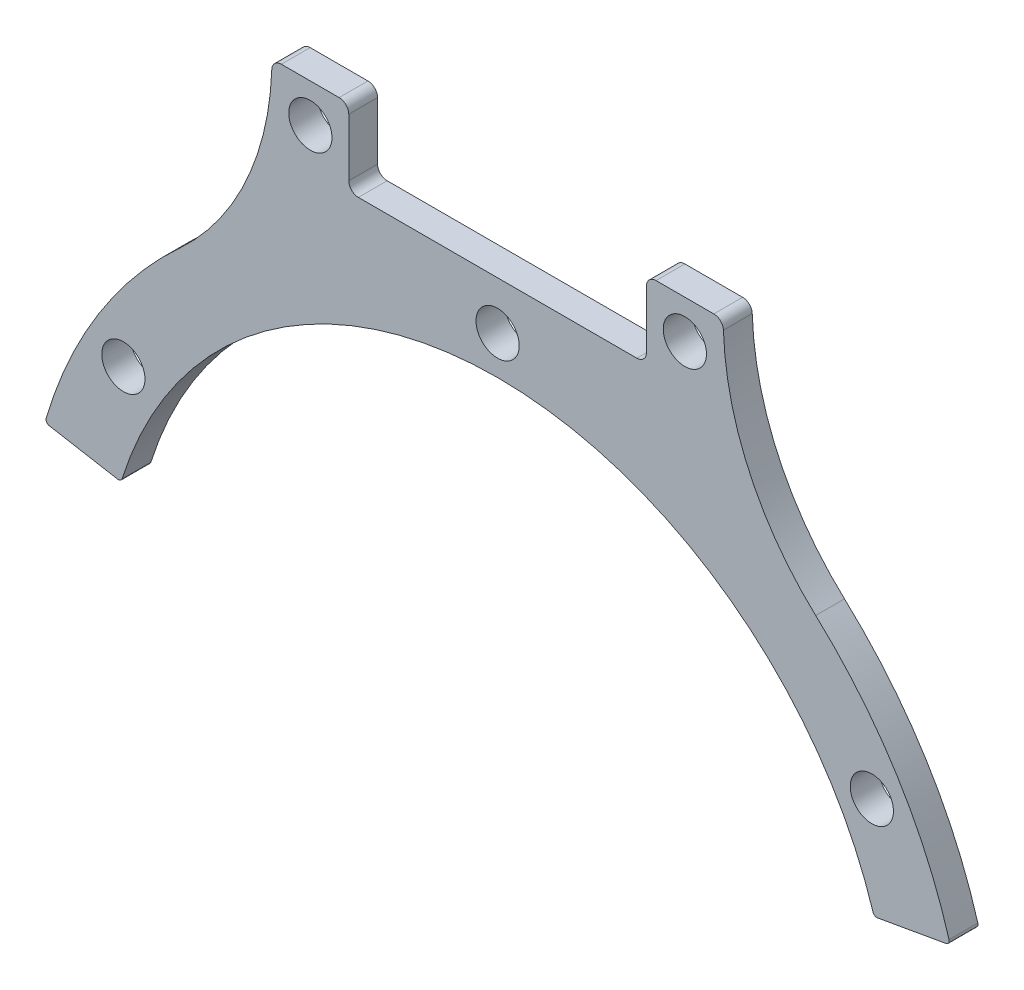
ISO-10303-21;
HEADER;
FILE_DESCRIPTION(('STEP AP214'),'2;1');
FILE_NAME('part.step','',(''),(''),'','','');
FILE_SCHEMA(('AUTOMOTIVE_DESIGN { 1 0 10303 214 1 1 1 1 }'));
ENDSEC;
DATA;
#1=APPLICATION_CONTEXT('core data for automotive mechanical design processes');
#2=APPLICATION_PROTOCOL_DEFINITION('international standard','automotive_design',2000,#1);
#3=PRODUCT_CONTEXT('',#1,'mechanical');
#4=PRODUCT('Part','Part','',(#3));
#5=PRODUCT_RELATED_PRODUCT_CATEGORY('part','',(#4));
#6=PRODUCT_DEFINITION_FORMATION('','',#4);
#7=PRODUCT_DEFINITION_CONTEXT('part definition',#1,'design');
#8=PRODUCT_DEFINITION('design','',#6,#7);
#9=PRODUCT_DEFINITION_SHAPE('','',#8);
#10=(LENGTH_UNIT() NAMED_UNIT(*) SI_UNIT(.MILLI.,.METRE.));
#11=(NAMED_UNIT(*) PLANE_ANGLE_UNIT() SI_UNIT($,.RADIAN.));
#12=(NAMED_UNIT(*) SI_UNIT($,.STERADIAN.) SOLID_ANGLE_UNIT());
#13=UNCERTAINTY_MEASURE_WITH_UNIT(LENGTH_MEASURE(1.E-05),#10,'distance_accuracy_value','');
#14=(GEOMETRIC_REPRESENTATION_CONTEXT(3) GLOBAL_UNCERTAINTY_ASSIGNED_CONTEXT((#13)) GLOBAL_UNIT_ASSIGNED_CONTEXT((#10,
#11,#12)) REPRESENTATION_CONTEXT('',''));
#15=CARTESIAN_POINT('',(0.,0.,0.));
#16=DIRECTION('',(0.,0.,1.));
#17=DIRECTION('',(1.,0.,0.));
#18=AXIS2_PLACEMENT_3D('',#15,#16,#17);
#19=CARTESIAN_POINT('',(53.2107843137256,-2.,3.));
#20=DIRECTION('',(0.,0.,-1.));
#21=DIRECTION('',(-1.,0.,0.));
#22=AXIS2_PLACEMENT_3D('',#19,#20,#21);
#23=CYLINDRICAL_SURFACE('',#22,29.7107843137256);
#24=CARTESIAN_POINT('',(53.2107843137256,-2.,0.));
#25=DIRECTION('',(0.,0.,1.));
#26=DIRECTION('',(1.,0.,0.));
#27=AXIS2_PLACEMENT_3D('',#24,#25,#26);
#28=CIRCLE('',#27,29.7107843137256);
#29=CARTESIAN_POINT('',(23.5157549659432,-2.96743814844374,0.));
#30=VERTEX_POINT('',#29);
#31=CARTESIAN_POINT('',(33.1254281621723,-23.8931307218037,0.));
#32=VERTEX_POINT('',#31);
#33=EDGE_CURVE('E233',#30,#32,#28,.T.);
#34=ORIENTED_EDGE('',*,*,#33,.F.);
#35=DIRECTION('',(0.,0.,-1.));
#36=VECTOR('',#35,1.);
#37=CARTESIAN_POINT('',(23.5157549659432,-2.96743814844374,3.));
#38=LINE('',#37,#36);
#39=CARTESIAN_POINT('',(23.5157549659432,-2.96743814844374,3.));
#40=VERTEX_POINT('',#39);
#41=EDGE_CURVE('E11',#40,#30,#38,.T.);
#42=ORIENTED_EDGE('',*,*,#41,.F.);
#43=CARTESIAN_POINT('',(53.2107843137256,-2.,3.));
#44=DIRECTION('',(0.,0.,1.));
#45=DIRECTION('',(1.,0.,0.));
#46=AXIS2_PLACEMENT_3D('',#43,#44,#45);
#47=CIRCLE('',#46,29.7107843137256);
#48=CARTESIAN_POINT('',(33.1254281621723,-23.8931307218037,3.));
#49=VERTEX_POINT('',#48);
#50=EDGE_CURVE('E318',#40,#49,#47,.T.);
#51=ORIENTED_EDGE('',*,*,#50,.T.);
#52=DIRECTION('',(0.,0.,-1.));
#53=VECTOR('',#52,1.);
#54=CARTESIAN_POINT('',(33.1254281621723,-23.8931307218037,3.));
#55=LINE('',#54,#53);
#56=EDGE_CURVE('E48',#49,#32,#55,.T.);
#57=ORIENTED_EDGE('',*,*,#56,.T.);
#58=EDGE_LOOP('',(#34,#42,#51,#57));
#59=FACE_BOUND('',#58,.T.);
#60=ADVANCED_FACE('F45',(#59),#23,.F.);
#61=CARTESIAN_POINT('',(22.5162852436288,-3.,3.));
#62=DIRECTION('',(0.,0.,-1.));
#63=DIRECTION('',(-1.,0.,0.));
#64=AXIS2_PLACEMENT_3D('',#61,#62,#63);
#65=CYLINDRICAL_SURFACE('',#64,1.);
#66=CARTESIAN_POINT('',(22.5162852436288,-3.,0.));
#67=DIRECTION('',(0.,0.,-1.));
#68=DIRECTION('',(-1.,0.,0.));
#69=AXIS2_PLACEMENT_3D('',#66,#67,#68);
#70=CIRCLE('',#69,1.);
#71=CARTESIAN_POINT('',(22.5162852436288,-2.,0.));
#72=VERTEX_POINT('',#71);
#73=EDGE_CURVE('E315',#72,#30,#70,.T.);
#74=ORIENTED_EDGE('',*,*,#73,.F.);
#75=DIRECTION('',(0.,0.,-1.));
#76=VECTOR('',#75,1.);
#77=CARTESIAN_POINT('',(22.5162852436288,-2.,3.));
#78=LINE('',#77,#76);
#79=CARTESIAN_POINT('',(22.5162852436288,-2.,3.));
#80=VERTEX_POINT('',#79);
#81=EDGE_CURVE('E55',#80,#72,#78,.T.);
#82=ORIENTED_EDGE('',*,*,#81,.F.);
#83=CARTESIAN_POINT('',(22.5162852436288,-3.,3.));
#84=DIRECTION('',(0.,0.,-1.));
#85=DIRECTION('',(-1.,0.,0.));
#86=AXIS2_PLACEMENT_3D('',#83,#84,#85);
#87=CIRCLE('',#86,1.);
#88=EDGE_CURVE('E218',#80,#40,#87,.T.);
#89=ORIENTED_EDGE('',*,*,#88,.T.);
#90=ORIENTED_EDGE('',*,*,#41,.T.);
#91=EDGE_LOOP('',(#74,#82,#89,#90));
#92=FACE_BOUND('',#91,.T.);
#93=ADVANCED_FACE('F379',(#92),#65,.T.);
#94=CARTESIAN_POINT('',(16.5,-2.,3.));
#95=DIRECTION('',(0.,1.,0.));
#96=DIRECTION('',(0.,0.,1.));
#97=AXIS2_PLACEMENT_3D('',#94,#95,#96);
#98=PLANE('',#97);
#99=DIRECTION('',(1.,0.,0.));
#100=VECTOR('',#99,1.);
#101=CARTESIAN_POINT('',(16.5,-2.,0.));
#102=LINE('',#101,#100);
#103=CARTESIAN_POINT('',(16.5,-2.,0.));
#104=VERTEX_POINT('',#103);
#105=EDGE_CURVE('E204',#104,#72,#102,.T.);
#106=ORIENTED_EDGE('',*,*,#105,.F.);
#107=DIRECTION('',(0.,0.,-1.));
#108=VECTOR('',#107,1.);
#109=CARTESIAN_POINT('',(16.5,-2.,3.));
#110=LINE('',#109,#108);
#111=CARTESIAN_POINT('',(16.5,-2.,3.));
#112=VERTEX_POINT('',#111);
#113=EDGE_CURVE('E199',#112,#104,#110,.T.);
#114=ORIENTED_EDGE('',*,*,#113,.F.);
#115=DIRECTION('',(1.,0.,0.));
#116=VECTOR('',#115,1.);
#117=CARTESIAN_POINT('',(16.5,-2.,3.));
#118=LINE('',#117,#116);
#119=EDGE_CURVE('E202',#112,#80,#118,.T.);
#120=ORIENTED_EDGE('',*,*,#119,.T.);
#121=ORIENTED_EDGE('',*,*,#81,.T.);
#122=EDGE_LOOP('',(#106,#114,#120,#121));
#123=FACE_BOUND('',#122,.T.);
#124=ADVANCED_FACE('F201',(#123),#98,.T.);
#125=CARTESIAN_POINT('',(16.5,-3.,3.));
#126=DIRECTION('',(0.,0.,-1.));
#127=DIRECTION('',(-1.,0.,0.));
#128=AXIS2_PLACEMENT_3D('',#125,#126,#127);
#129=CYLINDRICAL_SURFACE('',#128,1.);
#130=CARTESIAN_POINT('',(16.5,-3.,0.));
#131=DIRECTION('',(0.,0.,-1.));
#132=DIRECTION('',(-1.,0.,0.));
#133=AXIS2_PLACEMENT_3D('',#130,#131,#132);
#134=CIRCLE('',#133,1.);
#135=CARTESIAN_POINT('',(15.5,-3.,0.));
#136=VERTEX_POINT('',#135);
#137=EDGE_CURVE('E310',#136,#104,#134,.T.);
#138=ORIENTED_EDGE('',*,*,#137,.F.);
#139=DIRECTION('',(0.,0.,-1.));
#140=VECTOR('',#139,1.);
#141=CARTESIAN_POINT('',(15.5,-3.,3.));
#142=LINE('',#141,#140);
#143=CARTESIAN_POINT('',(15.5,-3.,3.));
#144=VERTEX_POINT('',#143);
#145=EDGE_CURVE('E210',#144,#136,#142,.T.);
#146=ORIENTED_EDGE('',*,*,#145,.F.);
#147=CARTESIAN_POINT('',(16.5,-3.,3.));
#148=DIRECTION('',(0.,0.,-1.));
#149=DIRECTION('',(-1.,0.,0.));
#150=AXIS2_PLACEMENT_3D('',#147,#148,#149);
#151=CIRCLE('',#150,1.);
#152=EDGE_CURVE('E216',#144,#112,#151,.T.);
#153=ORIENTED_EDGE('',*,*,#152,.T.);
#154=ORIENTED_EDGE('',*,*,#113,.T.);
#155=EDGE_LOOP('',(#138,#146,#153,#154));
#156=FACE_BOUND('',#155,.T.);
#157=ADVANCED_FACE('F221',(#156),#129,.T.);
#158=CARTESIAN_POINT('',(15.5,-9.,3.));
#159=DIRECTION('',(-1.,0.,0.));
#160=DIRECTION('',(0.,0.,1.));
#161=AXIS2_PLACEMENT_3D('',#158,#159,#160);
#162=PLANE('',#161);
#163=DIRECTION('',(0.,1.,0.));
#164=VECTOR('',#163,1.);
#165=CARTESIAN_POINT('',(15.5,-9.,0.));
#166=LINE('',#165,#164);
#167=CARTESIAN_POINT('',(15.5,-9.,0.));
#168=VERTEX_POINT('',#167);
#169=EDGE_CURVE('E306',#168,#136,#166,.T.);
#170=ORIENTED_EDGE('',*,*,#169,.F.);
#171=DIRECTION('',(0.,0.,-1.));
#172=VECTOR('',#171,1.);
#173=CARTESIAN_POINT('',(15.5,-9.,3.));
#174=LINE('',#173,#172);
#175=CARTESIAN_POINT('',(15.5,-9.,3.));
#176=VERTEX_POINT('',#175);
#177=EDGE_CURVE('E324',#176,#168,#174,.T.);
#178=ORIENTED_EDGE('',*,*,#177,.F.);
#179=DIRECTION('',(0.,1.,0.));
#180=VECTOR('',#179,1.);
#181=CARTESIAN_POINT('',(15.5,-9.,3.));
#182=LINE('',#181,#180);
#183=EDGE_CURVE('E223',#176,#144,#182,.T.);
#184=ORIENTED_EDGE('',*,*,#183,.T.);
#185=ORIENTED_EDGE('',*,*,#145,.T.);
#186=EDGE_LOOP('',(#170,#178,#184,#185));
#187=FACE_BOUND('',#186,.T.);
#188=ADVANCED_FACE('F391',(#187),#162,.T.);
#189=CARTESIAN_POINT('',(14.5,-9.,3.));
#190=DIRECTION('',(0.,0.,-1.));
#191=DIRECTION('',(-1.,0.,0.));
#192=AXIS2_PLACEMENT_3D('',#189,#190,#191);
#193=CYLINDRICAL_SURFACE('',#192,1.);
#194=CARTESIAN_POINT('',(14.5,-9.,0.));
#195=DIRECTION('',(0.,0.,1.));
#196=DIRECTION('',(1.,0.,0.));
#197=AXIS2_PLACEMENT_3D('',#194,#195,#196);
#198=CIRCLE('',#197,1.);
#199=CARTESIAN_POINT('',(14.5,-10.,0.));
#200=VERTEX_POINT('',#199);
#201=EDGE_CURVE('E302',#200,#168,#198,.T.);
#202=ORIENTED_EDGE('',*,*,#201,.F.);
#203=DIRECTION('',(0.,0.,-1.));
#204=VECTOR('',#203,1.);
#205=CARTESIAN_POINT('',(14.5,-10.,3.));
#206=LINE('',#205,#204);
#207=CARTESIAN_POINT('',(14.5,-10.,3.));
#208=VERTEX_POINT('',#207);
#209=EDGE_CURVE('E327',#208,#200,#206,.T.);
#210=ORIENTED_EDGE('',*,*,#209,.F.);
#211=CARTESIAN_POINT('',(14.5,-9.,3.));
#212=DIRECTION('',(0.,0.,1.));
#213=DIRECTION('',(1.,0.,0.));
#214=AXIS2_PLACEMENT_3D('',#211,#212,#213);
#215=CIRCLE('',#214,1.);
#216=EDGE_CURVE('E227',#208,#176,#215,.T.);
#217=ORIENTED_EDGE('',*,*,#216,.T.);
#218=ORIENTED_EDGE('',*,*,#177,.T.);
#219=EDGE_LOOP('',(#202,#210,#217,#218));
#220=FACE_BOUND('',#219,.T.);
#221=ADVANCED_FACE('F394',(#220),#193,.F.);
#222=CARTESIAN_POINT('',(-14.5,-10.,3.));
#223=DIRECTION('',(0.,1.,0.));
#224=DIRECTION('',(0.,0.,1.));
#225=AXIS2_PLACEMENT_3D('',#222,#223,#224);
#226=PLANE('',#225);
#227=DIRECTION('',(1.,0.,0.));
#228=VECTOR('',#227,1.);
#229=CARTESIAN_POINT('',(-14.5,-10.,0.));
#230=LINE('',#229,#228);
#231=CARTESIAN_POINT('',(-14.5,-10.,0.));
#232=VERTEX_POINT('',#231);
#233=EDGE_CURVE('E298',#232,#200,#230,.T.);
#234=ORIENTED_EDGE('',*,*,#233,.F.);
#235=DIRECTION('',(0.,0.,-1.));
#236=VECTOR('',#235,1.);
#237=CARTESIAN_POINT('',(-14.5,-10.,3.));
#238=LINE('',#237,#236);
#239=CARTESIAN_POINT('',(-14.5,-10.,3.));
#240=VERTEX_POINT('',#239);
#241=EDGE_CURVE('E330',#240,#232,#238,.T.);
#242=ORIENTED_EDGE('',*,*,#241,.F.);
#243=DIRECTION('',(1.,0.,0.));
#244=VECTOR('',#243,1.);
#245=CARTESIAN_POINT('',(-14.5,-10.,3.));
#246=LINE('',#245,#244);
#247=EDGE_CURVE('E589',#240,#208,#246,.T.);
#248=ORIENTED_EDGE('',*,*,#247,.T.);
#249=ORIENTED_EDGE('',*,*,#209,.T.);
#250=EDGE_LOOP('',(#234,#242,#248,#249));
#251=FACE_BOUND('',#250,.T.);
#252=ADVANCED_FACE('F398',(#251),#226,.T.);
#253=CARTESIAN_POINT('',(-14.5,-9.,3.));
#254=DIRECTION('',(0.,0.,-1.));
#255=DIRECTION('',(-1.,0.,0.));
#256=AXIS2_PLACEMENT_3D('',#253,#254,#255);
#257=CYLINDRICAL_SURFACE('',#256,1.);
#258=CARTESIAN_POINT('',(-14.5,-9.,0.));
#259=DIRECTION('',(0.,0.,1.));
#260=DIRECTION('',(1.,0.,0.));
#261=AXIS2_PLACEMENT_3D('',#258,#259,#260);
#262=CIRCLE('',#261,1.);
#263=CARTESIAN_POINT('',(-15.5,-9.,0.));
#264=VERTEX_POINT('',#263);
#265=EDGE_CURVE('E294',#264,#232,#262,.T.);
#266=ORIENTED_EDGE('',*,*,#265,.F.);
#267=DIRECTION('',(0.,0.,-1.));
#268=VECTOR('',#267,1.);
#269=CARTESIAN_POINT('',(-15.5,-9.,3.));
#270=LINE('',#269,#268);
#271=CARTESIAN_POINT('',(-15.5,-9.,3.));
#272=VERTEX_POINT('',#271);
#273=EDGE_CURVE('E333',#272,#264,#270,.T.);
#274=ORIENTED_EDGE('',*,*,#273,.F.);
#275=CARTESIAN_POINT('',(-14.5,-9.,3.));
#276=DIRECTION('',(0.,0.,1.));
#277=DIRECTION('',(1.,0.,0.));
#278=AXIS2_PLACEMENT_3D('',#275,#276,#277);
#279=CIRCLE('',#278,1.);
#280=EDGE_CURVE('E585',#272,#240,#279,.T.);
#281=ORIENTED_EDGE('',*,*,#280,.T.);
#282=ORIENTED_EDGE('',*,*,#241,.T.);
#283=EDGE_LOOP('',(#266,#274,#281,#282));
#284=FACE_BOUND('',#283,.T.);
#285=ADVANCED_FACE('F402',(#284),#257,.F.);
#286=CARTESIAN_POINT('',(-15.5,-3.,3.));
#287=DIRECTION('',(1.,0.,0.));
#288=DIRECTION('',(0.,0.,-1.));
#289=AXIS2_PLACEMENT_3D('',#286,#287,#288);
#290=PLANE('',#289);
#291=DIRECTION('',(0.,-1.,0.));
#292=VECTOR('',#291,1.);
#293=CARTESIAN_POINT('',(-15.5,-3.,0.));
#294=LINE('',#293,#292);
#295=CARTESIAN_POINT('',(-15.5,-3.,0.));
#296=VERTEX_POINT('',#295);
#297=EDGE_CURVE('E290',#296,#264,#294,.T.);
#298=ORIENTED_EDGE('',*,*,#297,.F.);
#299=DIRECTION('',(0.,0.,-1.));
#300=VECTOR('',#299,1.);
#301=CARTESIAN_POINT('',(-15.5,-3.,3.));
#302=LINE('',#301,#300);
#303=CARTESIAN_POINT('',(-15.5,-3.,3.));
#304=VERTEX_POINT('',#303);
#305=EDGE_CURVE('E336',#304,#296,#302,.T.);
#306=ORIENTED_EDGE('',*,*,#305,.F.);
#307=DIRECTION('',(0.,-1.,0.));
#308=VECTOR('',#307,1.);
#309=CARTESIAN_POINT('',(-15.5,-3.,3.));
#310=LINE('',#309,#308);
#311=EDGE_CURVE('E581',#304,#272,#310,.T.);
#312=ORIENTED_EDGE('',*,*,#311,.T.);
#313=ORIENTED_EDGE('',*,*,#273,.T.);
#314=EDGE_LOOP('',(#298,#306,#312,#313));
#315=FACE_BOUND('',#314,.T.);
#316=ADVANCED_FACE('F406',(#315),#290,.T.);
#317=CARTESIAN_POINT('',(-16.5,-3.,3.));
#318=DIRECTION('',(0.,0.,-1.));
#319=DIRECTION('',(-1.,0.,0.));
#320=AXIS2_PLACEMENT_3D('',#317,#318,#319);
#321=CYLINDRICAL_SURFACE('',#320,1.);
#322=CARTESIAN_POINT('',(-16.5,-3.,0.));
#323=DIRECTION('',(0.,0.,-1.));
#324=DIRECTION('',(-1.,0.,0.));
#325=AXIS2_PLACEMENT_3D('',#322,#323,#324);
#326=CIRCLE('',#325,1.);
#327=CARTESIAN_POINT('',(-16.5,-2.,0.));
#328=VERTEX_POINT('',#327);
#329=EDGE_CURVE('E286',#328,#296,#326,.T.);
#330=ORIENTED_EDGE('',*,*,#329,.F.);
#331=DIRECTION('',(0.,0.,-1.));
#332=VECTOR('',#331,1.);
#333=CARTESIAN_POINT('',(-16.5,-2.,3.));
#334=LINE('',#333,#332);
#335=CARTESIAN_POINT('',(-16.5,-2.,3.));
#336=VERTEX_POINT('',#335);
#337=EDGE_CURVE('E339',#336,#328,#334,.T.);
#338=ORIENTED_EDGE('',*,*,#337,.F.);
#339=CARTESIAN_POINT('',(-16.5,-3.,3.));
#340=DIRECTION('',(0.,0.,-1.));
#341=DIRECTION('',(-1.,0.,0.));
#342=AXIS2_PLACEMENT_3D('',#339,#340,#341);
#343=CIRCLE('',#342,1.);
#344=EDGE_CURVE('E577',#336,#304,#343,.T.);
#345=ORIENTED_EDGE('',*,*,#344,.T.);
#346=ORIENTED_EDGE('',*,*,#305,.T.);
#347=EDGE_LOOP('',(#330,#338,#345,#346));
#348=FACE_BOUND('',#347,.T.);
#349=ADVANCED_FACE('F410',(#348),#321,.T.);
#350=CARTESIAN_POINT('',(-22.5162852436288,-2.,3.));
#351=DIRECTION('',(0.,1.,0.));
#352=DIRECTION('',(0.,0.,1.));
#353=AXIS2_PLACEMENT_3D('',#350,#351,#352);
#354=PLANE('',#353);
#355=DIRECTION('',(1.,0.,0.));
#356=VECTOR('',#355,1.);
#357=CARTESIAN_POINT('',(-22.5162852436288,-2.,0.));
#358=LINE('',#357,#356);
#359=CARTESIAN_POINT('',(-22.5162852436288,-2.,0.));
#360=VERTEX_POINT('',#359);
#361=EDGE_CURVE('E282',#360,#328,#358,.T.);
#362=ORIENTED_EDGE('',*,*,#361,.F.);
#363=DIRECTION('',(0.,0.,-1.));
#364=VECTOR('',#363,1.);
#365=CARTESIAN_POINT('',(-22.5162852436288,-2.,3.));
#366=LINE('',#365,#364);
#367=CARTESIAN_POINT('',(-22.5162852436288,-2.,3.));
#368=VERTEX_POINT('',#367);
#369=EDGE_CURVE('E342',#368,#360,#366,.T.);
#370=ORIENTED_EDGE('',*,*,#369,.F.);
#371=DIRECTION('',(1.,0.,0.));
#372=VECTOR('',#371,1.);
#373=CARTESIAN_POINT('',(-22.5162852436288,-2.,3.));
#374=LINE('',#373,#372);
#375=EDGE_CURVE('E573',#368,#336,#374,.T.);
#376=ORIENTED_EDGE('',*,*,#375,.T.);
#377=ORIENTED_EDGE('',*,*,#337,.T.);
#378=EDGE_LOOP('',(#362,#370,#376,#377));
#379=FACE_BOUND('',#378,.T.);
#380=ADVANCED_FACE('F414',(#379),#354,.T.);
#381=CARTESIAN_POINT('',(-22.5162852436288,-3.,3.));
#382=DIRECTION('',(0.,0.,-1.));
#383=DIRECTION('',(-1.,0.,0.));
#384=AXIS2_PLACEMENT_3D('',#381,#382,#383);
#385=CYLINDRICAL_SURFACE('',#384,1.);
#386=CARTESIAN_POINT('',(-22.5162852436288,-3.,0.));
#387=DIRECTION('',(0.,0.,-1.));
#388=DIRECTION('',(-1.,0.,0.));
#389=AXIS2_PLACEMENT_3D('',#386,#387,#388);
#390=CIRCLE('',#389,1.);
#391=CARTESIAN_POINT('',(-23.5157549659432,-2.96743814844374,0.));
#392=VERTEX_POINT('',#391);
#393=EDGE_CURVE('E278',#392,#360,#390,.T.);
#394=ORIENTED_EDGE('',*,*,#393,.F.);
#395=DIRECTION('',(0.,0.,-1.));
#396=VECTOR('',#395,1.);
#397=CARTESIAN_POINT('',(-23.5157549659432,-2.96743814844374,3.));
#398=LINE('',#397,#396);
#399=CARTESIAN_POINT('',(-23.5157549659432,-2.96743814844374,3.));
#400=VERTEX_POINT('',#399);
#401=EDGE_CURVE('E345',#400,#392,#398,.T.);
#402=ORIENTED_EDGE('',*,*,#401,.F.);
#403=CARTESIAN_POINT('',(-22.5162852436288,-3.,3.));
#404=DIRECTION('',(0.,0.,-1.));
#405=DIRECTION('',(-1.,0.,0.));
#406=AXIS2_PLACEMENT_3D('',#403,#404,#405);
#407=CIRCLE('',#406,1.);
#408=EDGE_CURVE('E569',#400,#368,#407,.T.);
#409=ORIENTED_EDGE('',*,*,#408,.T.);
#410=ORIENTED_EDGE('',*,*,#369,.T.);
#411=EDGE_LOOP('',(#394,#402,#409,#410));
#412=FACE_BOUND('',#411,.T.);
#413=ADVANCED_FACE('F418',(#412),#385,.T.);
#414=CARTESIAN_POINT('',(-53.2107843137256,-2.,3.));
#415=DIRECTION('',(0.,0.,-1.));
#416=DIRECTION('',(-1.,0.,0.));
#417=AXIS2_PLACEMENT_3D('',#414,#415,#416);
#418=CYLINDRICAL_SURFACE('',#417,29.7107843137256);
#419=CARTESIAN_POINT('',(-53.2107843137256,-2.,0.));
#420=DIRECTION('',(0.,0.,1.));
#421=DIRECTION('',(1.,0.,0.));
#422=AXIS2_PLACEMENT_3D('',#419,#420,#421);
#423=CIRCLE('',#422,29.7107843137256);
#424=CARTESIAN_POINT('',(-33.1254281621723,-23.8931307218036,0.));
#425=VERTEX_POINT('',#424);
#426=EDGE_CURVE('E274',#425,#392,#423,.T.);
#427=ORIENTED_EDGE('',*,*,#426,.F.);
#428=DIRECTION('',(0.,0.,-1.));
#429=VECTOR('',#428,1.);
#430=CARTESIAN_POINT('',(-33.1254281621723,-23.8931307218036,3.));
#431=LINE('',#430,#429);
#432=CARTESIAN_POINT('',(-33.1254281621723,-23.8931307218036,3.));
#433=VERTEX_POINT('',#432);
#434=EDGE_CURVE('E348',#433,#425,#431,.T.);
#435=ORIENTED_EDGE('',*,*,#434,.F.);
#436=CARTESIAN_POINT('',(-53.2107843137256,-2.,3.));
#437=DIRECTION('',(0.,0.,1.));
#438=DIRECTION('',(1.,0.,0.));
#439=AXIS2_PLACEMENT_3D('',#436,#437,#438);
#440=CIRCLE('',#439,29.7107843137256);
#441=EDGE_CURVE('E565',#433,#400,#440,.T.);
#442=ORIENTED_EDGE('',*,*,#441,.T.);
#443=ORIENTED_EDGE('',*,*,#401,.T.);
#444=EDGE_LOOP('',(#427,#435,#442,#443));
#445=FACE_BOUND('',#444,.T.);
#446=ADVANCED_FACE('F422',(#445),#418,.F.);
#447=CARTESIAN_POINT('',(0.,-60.,3.));
#448=DIRECTION('',(0.,0.,-1.));
#449=DIRECTION('',(-1.,0.,0.));
#450=AXIS2_PLACEMENT_3D('',#447,#448,#449);
#451=CYLINDRICAL_SURFACE('',#450,48.9999999999999);
#452=CARTESIAN_POINT('',(0.,-60.,0.));
#453=DIRECTION('',(0.,0.,-1.));
#454=DIRECTION('',(-1.,0.,0.));
#455=AXIS2_PLACEMENT_3D('',#452,#453,#454);
#456=CIRCLE('',#455,48.9999999999999);
#457=CARTESIAN_POINT('',(-47.0113630081253,-46.1821945259653,0.));
#458=VERTEX_POINT('',#457);
#459=EDGE_CURVE('E270',#458,#425,#456,.T.);
#460=ORIENTED_EDGE('',*,*,#459,.F.);
#461=DIRECTION('',(0.,0.,-1.));
#462=VECTOR('',#461,1.);
#463=CARTESIAN_POINT('',(-47.0113630081253,-46.1821945259653,3.));
#464=LINE('',#463,#462);
#465=CARTESIAN_POINT('',(-47.0113630081253,-46.1821945259653,3.));
#466=VERTEX_POINT('',#465);
#467=EDGE_CURVE('E351',#466,#458,#464,.T.);
#468=ORIENTED_EDGE('',*,*,#467,.F.);
#469=CARTESIAN_POINT('',(0.,-60.,3.));
#470=DIRECTION('',(0.,0.,-1.));
#471=DIRECTION('',(-1.,0.,0.));
#472=AXIS2_PLACEMENT_3D('',#469,#470,#471);
#473=CIRCLE('',#472,48.9999999999999);
#474=EDGE_CURVE('E561',#466,#433,#473,.T.);
#475=ORIENTED_EDGE('',*,*,#474,.T.);
#476=ORIENTED_EDGE('',*,*,#434,.T.);
#477=EDGE_LOOP('',(#460,#468,#475,#476));
#478=FACE_BOUND('',#477,.T.);
#479=ADVANCED_FACE('F426',(#478),#451,.T.);
#480=CARTESIAN_POINT('',(-46.6275967794876,-46.2949929379982,3.));
#481=DIRECTION('',(0.,0.,-1.));
#482=DIRECTION('',(-1.,0.,0.));
#483=AXIS2_PLACEMENT_3D('',#480,#481,#482);
#484=CYLINDRICAL_SURFACE('',#483,0.399999999999953);
#485=CARTESIAN_POINT('',(-46.6275967794876,-46.2949929379982,0.));
#486=DIRECTION('',(0.,0.,-1.));
#487=DIRECTION('',(-1.,0.,0.));
#488=AXIS2_PLACEMENT_3D('',#485,#486,#487);
#489=CIRCLE('',#488,0.399999999999953);
#490=CARTESIAN_POINT('',(-46.6970560505543,-46.6889160392031,0.));
#491=VERTEX_POINT('',#490);
#492=EDGE_CURVE('E266',#491,#458,#489,.T.);
#493=ORIENTED_EDGE('',*,*,#492,.F.);
#494=DIRECTION('',(0.,0.,-1.));
#495=VECTOR('',#494,1.);
#496=CARTESIAN_POINT('',(-46.6970560505543,-46.6889160392031,3.));
#497=LINE('',#496,#495);
#498=CARTESIAN_POINT('',(-46.6970560505543,-46.6889160392031,3.));
#499=VERTEX_POINT('',#498);
#500=EDGE_CURVE('E354',#499,#491,#497,.T.);
#501=ORIENTED_EDGE('',*,*,#500,.F.);
#502=CARTESIAN_POINT('',(-46.6275967794876,-46.2949929379982,3.));
#503=DIRECTION('',(0.,0.,-1.));
#504=DIRECTION('',(-1.,0.,0.));
#505=AXIS2_PLACEMENT_3D('',#502,#503,#504);
#506=CIRCLE('',#505,0.399999999999953);
#507=EDGE_CURVE('E557',#499,#466,#506,.T.);
#508=ORIENTED_EDGE('',*,*,#507,.T.);
#509=ORIENTED_EDGE('',*,*,#467,.T.);
#510=EDGE_LOOP('',(#493,#501,#508,#509));
#511=FACE_BOUND('',#510,.T.);
#512=ADVANCED_FACE('F430',(#511),#484,.T.);
#513=CARTESIAN_POINT('',(-39.5544886552037,-47.948343382532,3.));
#514=DIRECTION('',(-0.173648177666936,-0.984807753012207,0.));
#515=DIRECTION('',(0.984807753012207,-0.173648177666936,0.));
#516=AXIS2_PLACEMENT_3D('',#513,#514,#515);
#517=PLANE('',#516);
#518=DIRECTION('',(-0.984807753012207,0.173648177666936,0.));
#519=VECTOR('',#518,1.);
#520=CARTESIAN_POINT('',(-39.5544886552037,-47.948343382532,0.));
#521=LINE('',#520,#519);
#522=CARTESIAN_POINT('',(-39.5544886552037,-47.948343382532,0.));
#523=VERTEX_POINT('',#522);
#524=EDGE_CURVE('E262',#523,#491,#521,.T.);
#525=ORIENTED_EDGE('',*,*,#524,.F.);
#526=DIRECTION('',(0.,0.,-1.));
#527=VECTOR('',#526,1.);
#528=CARTESIAN_POINT('',(-39.5544886552037,-47.948343382532,3.));
#529=LINE('',#528,#527);
#530=CARTESIAN_POINT('',(-39.5544886552037,-47.948343382532,3.));
#531=VERTEX_POINT('',#530);
#532=EDGE_CURVE('E357',#531,#523,#529,.T.);
#533=ORIENTED_EDGE('',*,*,#532,.F.);
#534=DIRECTION('',(-0.984807753012207,0.173648177666936,0.));
#535=VECTOR('',#534,1.);
#536=CARTESIAN_POINT('',(-39.5544886552037,-47.948343382532,3.));
#537=LINE('',#536,#535);
#538=EDGE_CURVE('E553',#531,#499,#537,.T.);
#539=ORIENTED_EDGE('',*,*,#538,.T.);
#540=ORIENTED_EDGE('',*,*,#500,.T.);
#541=EDGE_LOOP('',(#525,#533,#539,#540));
#542=FACE_BOUND('',#541,.T.);
#543=ADVANCED_FACE('F434',(#542),#517,.T.);
#544=CARTESIAN_POINT('',(-39.485029384137,-47.5544202813271,3.));
#545=DIRECTION('',(0.,0.,-1.));
#546=DIRECTION('',(-1.,0.,0.));
#547=AXIS2_PLACEMENT_3D('',#544,#545,#546);
#548=CYLINDRICAL_SURFACE('',#547,0.400000000000025);
#549=CARTESIAN_POINT('',(-39.485029384137,-47.5544202813271,0.));
#550=DIRECTION('',(0.,0.,-1.));
#551=DIRECTION('',(-1.,0.,0.));
#552=AXIS2_PLACEMENT_3D('',#549,#550,#551);
#553=CIRCLE('',#552,0.400000000000025);
#554=CARTESIAN_POINT('',(-39.1035315156911,-47.6746674283674,0.));
#555=VERTEX_POINT('',#554);
#556=EDGE_CURVE('E258',#555,#523,#553,.T.);
#557=ORIENTED_EDGE('',*,*,#556,.F.);
#558=DIRECTION('',(0.,0.,-1.));
#559=VECTOR('',#558,1.);
#560=CARTESIAN_POINT('',(-39.1035315156911,-47.6746674283674,3.));
#561=LINE('',#560,#559);
#562=CARTESIAN_POINT('',(-39.1035315156911,-47.6746674283674,3.));
#563=VERTEX_POINT('',#562);
#564=EDGE_CURVE('E360',#563,#555,#561,.T.);
#565=ORIENTED_EDGE('',*,*,#564,.F.);
#566=CARTESIAN_POINT('',(-39.485029384137,-47.5544202813271,3.));
#567=DIRECTION('',(0.,0.,-1.));
#568=DIRECTION('',(-1.,0.,0.));
#569=AXIS2_PLACEMENT_3D('',#566,#567,#568);
#570=CIRCLE('',#569,0.400000000000025);
#571=EDGE_CURVE('E549',#563,#531,#570,.T.);
#572=ORIENTED_EDGE('',*,*,#571,.T.);
#573=ORIENTED_EDGE('',*,*,#532,.T.);
#574=EDGE_LOOP('',(#557,#565,#572,#573));
#575=FACE_BOUND('',#574,.T.);
#576=ADVANCED_FACE('F438',(#575),#548,.T.);
#577=CARTESIAN_POINT('',(0.,-60.,3.));
#578=DIRECTION('',(0.,0.,-1.));
#579=DIRECTION('',(-1.,0.,0.));
#580=AXIS2_PLACEMENT_3D('',#577,#578,#579);
#581=CYLINDRICAL_SURFACE('',#580,41.);
#582=CARTESIAN_POINT('',(0.,-60.,0.));
#583=DIRECTION('',(0.,0.,1.));
#584=DIRECTION('',(1.,0.,0.));
#585=AXIS2_PLACEMENT_3D('',#582,#583,#584);
#586=CIRCLE('',#585,41.);
#587=CARTESIAN_POINT('',(39.1035315156912,-47.6746674283674,0.));
#588=VERTEX_POINT('',#587);
#589=EDGE_CURVE('E254',#588,#555,#586,.T.);
#590=ORIENTED_EDGE('',*,*,#589,.F.);
#591=DIRECTION('',(0.,0.,-1.));
#592=VECTOR('',#591,1.);
#593=CARTESIAN_POINT('',(39.1035315156912,-47.6746674283674,3.));
#594=LINE('',#593,#592);
#595=CARTESIAN_POINT('',(39.1035315156912,-47.6746674283674,3.));
#596=VERTEX_POINT('',#595);
#597=EDGE_CURVE('E363',#596,#588,#594,.T.);
#598=ORIENTED_EDGE('',*,*,#597,.F.);
#599=CARTESIAN_POINT('',(0.,-60.,3.));
#600=DIRECTION('',(0.,0.,1.));
#601=DIRECTION('',(1.,0.,0.));
#602=AXIS2_PLACEMENT_3D('',#599,#600,#601);
#603=CIRCLE('',#602,41.);
#604=EDGE_CURVE('E545',#596,#563,#603,.T.);
#605=ORIENTED_EDGE('',*,*,#604,.T.);
#606=ORIENTED_EDGE('',*,*,#564,.T.);
#607=EDGE_LOOP('',(#590,#598,#605,#606));
#608=FACE_BOUND('',#607,.T.);
#609=ADVANCED_FACE('F442',(#608),#581,.F.);
#610=CARTESIAN_POINT('',(39.485029384137,-47.5544202813271,3.));
#611=DIRECTION('',(0.,0.,-1.));
#612=DIRECTION('',(-1.,0.,0.));
#613=AXIS2_PLACEMENT_3D('',#610,#611,#612);
#614=CYLINDRICAL_SURFACE('',#613,0.400000000000022);
#615=CARTESIAN_POINT('',(39.485029384137,-47.5544202813271,0.));
#616=DIRECTION('',(0.,0.,-1.));
#617=DIRECTION('',(-1.,0.,0.));
#618=AXIS2_PLACEMENT_3D('',#615,#616,#617);
#619=CIRCLE('',#618,0.400000000000022);
#620=CARTESIAN_POINT('',(39.5544886552037,-47.948343382532,0.));
#621=VERTEX_POINT('',#620);
#622=EDGE_CURVE('E250',#621,#588,#619,.T.);
#623=ORIENTED_EDGE('',*,*,#622,.F.);
#624=DIRECTION('',(0.,0.,-1.));
#625=VECTOR('',#624,1.);
#626=CARTESIAN_POINT('',(39.5544886552037,-47.948343382532,3.));
#627=LINE('',#626,#625);
#628=CARTESIAN_POINT('',(39.5544886552037,-47.948343382532,3.));
#629=VERTEX_POINT('',#628);
#630=EDGE_CURVE('E366',#629,#621,#627,.T.);
#631=ORIENTED_EDGE('',*,*,#630,.F.);
#632=CARTESIAN_POINT('',(39.485029384137,-47.5544202813271,3.));
#633=DIRECTION('',(0.,0.,-1.));
#634=DIRECTION('',(-1.,0.,0.));
#635=AXIS2_PLACEMENT_3D('',#632,#633,#634);
#636=CIRCLE('',#635,0.400000000000022);
#637=EDGE_CURVE('E541',#629,#596,#636,.T.);
#638=ORIENTED_EDGE('',*,*,#637,.T.);
#639=ORIENTED_EDGE('',*,*,#597,.T.);
#640=EDGE_LOOP('',(#623,#631,#638,#639));
#641=FACE_BOUND('',#640,.T.);
#642=ADVANCED_FACE('F446',(#641),#614,.T.);
#643=CARTESIAN_POINT('',(46.6970560505543,-46.6889160392031,3.));
#644=DIRECTION('',(0.173648177666932,-0.984807753012208,0.));
#645=DIRECTION('',(0.984807753012208,0.173648177666932,0.));
#646=AXIS2_PLACEMENT_3D('',#643,#644,#645);
#647=PLANE('',#646);
#648=DIRECTION('',(-0.984807753012208,-0.173648177666932,0.));
#649=VECTOR('',#648,1.);
#650=CARTESIAN_POINT('',(46.6970560505543,-46.6889160392031,0.));
#651=LINE('',#650,#649);
#652=CARTESIAN_POINT('',(46.6970560505543,-46.6889160392031,0.));
#653=VERTEX_POINT('',#652);
#654=EDGE_CURVE('E246',#653,#621,#651,.T.);
#655=ORIENTED_EDGE('',*,*,#654,.F.);
#656=DIRECTION('',(0.,0.,-1.));
#657=VECTOR('',#656,1.);
#658=CARTESIAN_POINT('',(46.6970560505543,-46.6889160392031,3.));
#659=LINE('',#658,#657);
#660=CARTESIAN_POINT('',(46.6970560505543,-46.6889160392031,3.));
#661=VERTEX_POINT('',#660);
#662=EDGE_CURVE('E369',#661,#653,#659,.T.);
#663=ORIENTED_EDGE('',*,*,#662,.F.);
#664=DIRECTION('',(-0.984807753012208,-0.173648177666932,0.));
#665=VECTOR('',#664,1.);
#666=CARTESIAN_POINT('',(46.6970560505543,-46.6889160392031,3.));
#667=LINE('',#666,#665);
#668=EDGE_CURVE('E537',#661,#629,#667,.T.);
#669=ORIENTED_EDGE('',*,*,#668,.T.);
#670=ORIENTED_EDGE('',*,*,#630,.T.);
#671=EDGE_LOOP('',(#655,#663,#669,#670));
#672=FACE_BOUND('',#671,.T.);
#673=ADVANCED_FACE('F450',(#672),#647,.T.);
#674=CARTESIAN_POINT('',(46.6275967794876,-46.2949929379982,3.));
#675=DIRECTION('',(0.,0.,-1.));
#676=DIRECTION('',(-1.,0.,0.));
#677=AXIS2_PLACEMENT_3D('',#674,#675,#676);
#678=CYLINDRICAL_SURFACE('',#677,0.399999999999966);
#679=CARTESIAN_POINT('',(46.6275967794876,-46.2949929379982,0.));
#680=DIRECTION('',(0.,0.,-1.));
#681=DIRECTION('',(-1.,0.,0.));
#682=AXIS2_PLACEMENT_3D('',#679,#680,#681);
#683=CIRCLE('',#682,0.399999999999966);
#684=CARTESIAN_POINT('',(47.0113630081253,-46.1821945259653,0.));
#685=VERTEX_POINT('',#684);
#686=EDGE_CURVE('E242',#685,#653,#683,.T.);
#687=ORIENTED_EDGE('',*,*,#686,.F.);
#688=DIRECTION('',(0.,0.,-1.));
#689=VECTOR('',#688,1.);
#690=CARTESIAN_POINT('',(47.0113630081253,-46.1821945259653,3.));
#691=LINE('',#690,#689);
#692=CARTESIAN_POINT('',(47.0113630081253,-46.1821945259653,3.));
#693=VERTEX_POINT('',#692);
#694=EDGE_CURVE('E371',#693,#685,#691,.T.);
#695=ORIENTED_EDGE('',*,*,#694,.F.);
#696=CARTESIAN_POINT('',(46.6275967794876,-46.2949929379982,3.));
#697=DIRECTION('',(0.,0.,-1.));
#698=DIRECTION('',(-1.,0.,0.));
#699=AXIS2_PLACEMENT_3D('',#696,#697,#698);
#700=CIRCLE('',#699,0.399999999999966);
#701=EDGE_CURVE('E533',#693,#661,#700,.T.);
#702=ORIENTED_EDGE('',*,*,#701,.T.);
#703=ORIENTED_EDGE('',*,*,#662,.T.);
#704=EDGE_LOOP('',(#687,#695,#702,#703));
#705=FACE_BOUND('',#704,.T.);
#706=ADVANCED_FACE('F454',(#705),#678,.T.);
#707=CARTESIAN_POINT('',(0.,-60.,3.));
#708=DIRECTION('',(0.,0.,-1.));
#709=DIRECTION('',(-1.,0.,0.));
#710=AXIS2_PLACEMENT_3D('',#707,#708,#709);
#711=CYLINDRICAL_SURFACE('',#710,49.);
#712=CARTESIAN_POINT('',(0.,-60.,0.));
#713=DIRECTION('',(0.,0.,-1.));
#714=DIRECTION('',(-1.,0.,0.));
#715=AXIS2_PLACEMENT_3D('',#712,#713,#714);
#716=CIRCLE('',#715,49.);
#717=EDGE_CURVE('E237',#32,#685,#716,.T.);
#718=ORIENTED_EDGE('',*,*,#717,.F.);
#719=ORIENTED_EDGE('',*,*,#56,.F.);
#720=CARTESIAN_POINT('',(0.,-60.,3.));
#721=DIRECTION('',(0.,0.,-1.));
#722=DIRECTION('',(-1.,0.,0.));
#723=AXIS2_PLACEMENT_3D('',#720,#721,#722);
#724=CIRCLE('',#723,49.);
#725=EDGE_CURVE('E530',#49,#693,#724,.T.);
#726=ORIENTED_EDGE('',*,*,#725,.T.);
#727=ORIENTED_EDGE('',*,*,#694,.T.);
#728=EDGE_LOOP('',(#718,#719,#726,#727));
#729=FACE_BOUND('',#728,.T.);
#730=ADVANCED_FACE('F376',(#729),#711,.T.);
#731=CARTESIAN_POINT('',(53.2107843137256,-2.,3.));
#732=DIRECTION('',(0.,0.,1.));
#733=DIRECTION('',(1.,0.,0.));
#734=AXIS2_PLACEMENT_3D('',#731,#732,#733);
#735=PLANE('',#734);
#736=CARTESIAN_POINT('',(19.5,-6.,3.));
#737=DIRECTION('',(0.,0.,-1.));
#738=DIRECTION('',(1.,0.,0.));
#739=AXIS2_PLACEMENT_3D('',#736,#737,#738);
#740=CIRCLE('',#739,2.25);
#741=CARTESIAN_POINT('',(21.75,-6.,3.));
#742=VERTEX_POINT('',#741);
#743=EDGE_CURVE('E490',#742,#742,#740,.T.);
#744=ORIENTED_EDGE('',*,*,#743,.T.);
#745=EDGE_LOOP('',(#744));
#746=FACE_BOUND('',#745,.T.);
#747=CARTESIAN_POINT('',(0.,-15.,3.));
#748=DIRECTION('',(0.,0.,-1.));
#749=DIRECTION('',(1.,0.,0.));
#750=AXIS2_PLACEMENT_3D('',#747,#748,#749);
#751=CIRCLE('',#750,2.25);
#752=CARTESIAN_POINT('',(2.25,-15.,3.));
#753=VERTEX_POINT('',#752);
#754=EDGE_CURVE('E500',#753,#753,#751,.T.);
#755=ORIENTED_EDGE('',*,*,#754,.T.);
#756=EDGE_LOOP('',(#755));
#757=FACE_BOUND('',#756,.T.);
#758=CARTESIAN_POINT('',(-38.9711431703,-37.5,3.));
#759=DIRECTION('',(0.,0.,-1.));
#760=DIRECTION('',(1.,0.,0.));
#761=AXIS2_PLACEMENT_3D('',#758,#759,#760);
#762=CIRCLE('',#761,2.25);
#763=CARTESIAN_POINT('',(-36.7211431703,-37.5,3.));
#764=VERTEX_POINT('',#763);
#765=EDGE_CURVE('E508',#764,#764,#762,.T.);
#766=ORIENTED_EDGE('',*,*,#765,.T.);
#767=EDGE_LOOP('',(#766));
#768=FACE_BOUND('',#767,.T.);
#769=CARTESIAN_POINT('',(-19.5,-6.,3.));
#770=DIRECTION('',(0.,0.,-1.));
#771=DIRECTION('',(1.,0.,0.));
#772=AXIS2_PLACEMENT_3D('',#769,#770,#771);
#773=CIRCLE('',#772,2.25);
#774=CARTESIAN_POINT('',(-17.25,-6.,3.));
#775=VERTEX_POINT('',#774);
#776=EDGE_CURVE('E516',#775,#775,#773,.T.);
#777=ORIENTED_EDGE('',*,*,#776,.T.);
#778=EDGE_LOOP('',(#777));
#779=FACE_BOUND('',#778,.T.);
#780=CARTESIAN_POINT('',(38.9711431703,-37.5,3.));
#781=DIRECTION('',(0.,0.,-1.));
#782=DIRECTION('',(1.,0.,0.));
#783=AXIS2_PLACEMENT_3D('',#780,#781,#782);
#784=CIRCLE('',#783,2.25);
#785=CARTESIAN_POINT('',(41.2211431703,-37.5,3.));
#786=VERTEX_POINT('',#785);
#787=EDGE_CURVE('E238',#786,#786,#784,.T.);
#788=ORIENTED_EDGE('',*,*,#787,.T.);
#789=EDGE_LOOP('',(#788));
#790=FACE_BOUND('',#789,.T.);
#791=ORIENTED_EDGE('',*,*,#50,.F.);
#792=ORIENTED_EDGE('',*,*,#88,.F.);
#793=ORIENTED_EDGE('',*,*,#119,.F.);
#794=ORIENTED_EDGE('',*,*,#152,.F.);
#795=ORIENTED_EDGE('',*,*,#183,.F.);
#796=ORIENTED_EDGE('',*,*,#216,.F.);
#797=ORIENTED_EDGE('',*,*,#247,.F.);
#798=ORIENTED_EDGE('',*,*,#280,.F.);
#799=ORIENTED_EDGE('',*,*,#311,.F.);
#800=ORIENTED_EDGE('',*,*,#344,.F.);
#801=ORIENTED_EDGE('',*,*,#375,.F.);
#802=ORIENTED_EDGE('',*,*,#408,.F.);
#803=ORIENTED_EDGE('',*,*,#441,.F.);
#804=ORIENTED_EDGE('',*,*,#474,.F.);
#805=ORIENTED_EDGE('',*,*,#507,.F.);
#806=ORIENTED_EDGE('',*,*,#538,.F.);
#807=ORIENTED_EDGE('',*,*,#571,.F.);
#808=ORIENTED_EDGE('',*,*,#604,.F.);
#809=ORIENTED_EDGE('',*,*,#637,.F.);
#810=ORIENTED_EDGE('',*,*,#668,.F.);
#811=ORIENTED_EDGE('',*,*,#701,.F.);
#812=ORIENTED_EDGE('',*,*,#725,.F.);
#813=EDGE_LOOP('',(#791,#792,#793,#794,#795,#796,#797,#798,#799,#800,#801,#802,#803,#804,#805,
#806,#807,#808,#809,#810,#811,#812));
#814=FACE_BOUND('',#813,.T.);
#815=ADVANCED_FACE('F214',(#746,#757,#768,#779,#790,#814),#735,.T.);
#816=CARTESIAN_POINT('',(53.2107843137256,-2.,0.));
#817=DIRECTION('',(0.,0.,1.));
#818=DIRECTION('',(1.,0.,0.));
#819=AXIS2_PLACEMENT_3D('',#816,#817,#818);
#820=PLANE('',#819);
#821=CARTESIAN_POINT('',(19.5,-6.,0.));
#822=DIRECTION('',(0.,0.,-1.));
#823=DIRECTION('',(1.,0.,0.));
#824=AXIS2_PLACEMENT_3D('',#821,#822,#823);
#825=CIRCLE('',#824,2.25);
#826=CARTESIAN_POINT('',(21.75,-6.,0.));
#827=VERTEX_POINT('',#826);
#828=EDGE_CURVE('E493',#827,#827,#825,.T.);
#829=ORIENTED_EDGE('',*,*,#828,.F.);
#830=EDGE_LOOP('',(#829));
#831=FACE_BOUND('',#830,.T.);
#832=CARTESIAN_POINT('',(0.,-15.,0.));
#833=DIRECTION('',(0.,0.,-1.));
#834=DIRECTION('',(1.,0.,0.));
#835=AXIS2_PLACEMENT_3D('',#832,#833,#834);
#836=CIRCLE('',#835,2.25);
#837=CARTESIAN_POINT('',(2.25,-15.,0.));
#838=VERTEX_POINT('',#837);
#839=EDGE_CURVE('E497',#838,#838,#836,.T.);
#840=ORIENTED_EDGE('',*,*,#839,.F.);
#841=EDGE_LOOP('',(#840));
#842=FACE_BOUND('',#841,.T.);
#843=CARTESIAN_POINT('',(-38.9711431703,-37.5,0.));
#844=DIRECTION('',(0.,0.,-1.));
#845=DIRECTION('',(1.,0.,0.));
#846=AXIS2_PLACEMENT_3D('',#843,#844,#845);
#847=CIRCLE('',#846,2.25);
#848=CARTESIAN_POINT('',(-36.7211431703,-37.5,0.));
#849=VERTEX_POINT('',#848);
#850=EDGE_CURVE('E504',#849,#849,#847,.T.);
#851=ORIENTED_EDGE('',*,*,#850,.F.);
#852=EDGE_LOOP('',(#851));
#853=FACE_BOUND('',#852,.T.);
#854=CARTESIAN_POINT('',(-19.5,-6.,0.));
#855=DIRECTION('',(0.,0.,-1.));
#856=DIRECTION('',(1.,0.,0.));
#857=AXIS2_PLACEMENT_3D('',#854,#855,#856);
#858=CIRCLE('',#857,2.25);
#859=CARTESIAN_POINT('',(-17.25,-6.,0.));
#860=VERTEX_POINT('',#859);
#861=EDGE_CURVE('E512',#860,#860,#858,.T.);
#862=ORIENTED_EDGE('',*,*,#861,.F.);
#863=EDGE_LOOP('',(#862));
#864=FACE_BOUND('',#863,.T.);
#865=CARTESIAN_POINT('',(38.9711431703,-37.5,0.));
#866=DIRECTION('',(0.,0.,-1.));
#867=DIRECTION('',(1.,0.,0.));
#868=AXIS2_PLACEMENT_3D('',#865,#866,#867);
#869=CIRCLE('',#868,2.25);
#870=CARTESIAN_POINT('',(41.2211431703,-37.5,0.));
#871=VERTEX_POINT('',#870);
#872=EDGE_CURVE('E520',#871,#871,#869,.T.);
#873=ORIENTED_EDGE('',*,*,#872,.F.);
#874=EDGE_LOOP('',(#873));
#875=FACE_BOUND('',#874,.T.);
#876=ORIENTED_EDGE('',*,*,#33,.T.);
#877=ORIENTED_EDGE('',*,*,#717,.T.);
#878=ORIENTED_EDGE('',*,*,#686,.T.);
#879=ORIENTED_EDGE('',*,*,#654,.T.);
#880=ORIENTED_EDGE('',*,*,#622,.T.);
#881=ORIENTED_EDGE('',*,*,#589,.T.);
#882=ORIENTED_EDGE('',*,*,#556,.T.);
#883=ORIENTED_EDGE('',*,*,#524,.T.);
#884=ORIENTED_EDGE('',*,*,#492,.T.);
#885=ORIENTED_EDGE('',*,*,#459,.T.);
#886=ORIENTED_EDGE('',*,*,#426,.T.);
#887=ORIENTED_EDGE('',*,*,#393,.T.);
#888=ORIENTED_EDGE('',*,*,#361,.T.);
#889=ORIENTED_EDGE('',*,*,#329,.T.);
#890=ORIENTED_EDGE('',*,*,#297,.T.);
#891=ORIENTED_EDGE('',*,*,#265,.T.);
#892=ORIENTED_EDGE('',*,*,#233,.T.);
#893=ORIENTED_EDGE('',*,*,#201,.T.);
#894=ORIENTED_EDGE('',*,*,#169,.T.);
#895=ORIENTED_EDGE('',*,*,#137,.T.);
#896=ORIENTED_EDGE('',*,*,#105,.T.);
#897=ORIENTED_EDGE('',*,*,#73,.T.);
#898=EDGE_LOOP('',(#876,#877,#878,#879,#880,#881,#882,#883,#884,#885,#886,#887,#888,#889,#890,
#891,#892,#893,#894,#895,#896,#897));
#899=FACE_BOUND('',#898,.T.);
#900=ADVANCED_FACE('F378',(#831,#842,#853,#864,#875,#899),#820,.F.);
#901=CARTESIAN_POINT('',(38.9711431703,-37.5,3.));
#902=DIRECTION('',(0.,0.,-1.));
#903=DIRECTION('',(-1.,0.,0.));
#904=AXIS2_PLACEMENT_3D('',#901,#902,#903);
#905=CYLINDRICAL_SURFACE('',#904,2.25);
#906=ORIENTED_EDGE('',*,*,#787,.F.);
#907=EDGE_LOOP('',(#906));
#908=FACE_BOUND('',#907,.T.);
#909=ORIENTED_EDGE('',*,*,#872,.T.);
#910=EDGE_LOOP('',(#909));
#911=FACE_BOUND('',#910,.T.);
#912=ADVANCED_FACE('F464',(#908,#911),#905,.F.);
#913=CARTESIAN_POINT('',(-19.5,-6.,3.));
#914=DIRECTION('',(0.,0.,-1.));
#915=DIRECTION('',(-1.,0.,0.));
#916=AXIS2_PLACEMENT_3D('',#913,#914,#915);
#917=CYLINDRICAL_SURFACE('',#916,2.25);
#918=ORIENTED_EDGE('',*,*,#776,.F.);
#919=EDGE_LOOP('',(#918));
#920=FACE_BOUND('',#919,.T.);
#921=ORIENTED_EDGE('',*,*,#861,.T.);
#922=EDGE_LOOP('',(#921));
#923=FACE_BOUND('',#922,.T.);
#924=ADVANCED_FACE('F471',(#920,#923),#917,.F.);
#925=CARTESIAN_POINT('',(-38.9711431703,-37.5,3.));
#926=DIRECTION('',(0.,0.,-1.));
#927=DIRECTION('',(-1.,0.,0.));
#928=AXIS2_PLACEMENT_3D('',#925,#926,#927);
#929=CYLINDRICAL_SURFACE('',#928,2.25);
#930=ORIENTED_EDGE('',*,*,#765,.F.);
#931=EDGE_LOOP('',(#930));
#932=FACE_BOUND('',#931,.T.);
#933=ORIENTED_EDGE('',*,*,#850,.T.);
#934=EDGE_LOOP('',(#933));
#935=FACE_BOUND('',#934,.T.);
#936=ADVANCED_FACE('F475',(#932,#935),#929,.F.);
#937=CARTESIAN_POINT('',(0.,-15.,3.));
#938=DIRECTION('',(0.,0.,-1.));
#939=DIRECTION('',(-1.,0.,0.));
#940=AXIS2_PLACEMENT_3D('',#937,#938,#939);
#941=CYLINDRICAL_SURFACE('',#940,2.25);
#942=ORIENTED_EDGE('',*,*,#754,.F.);
#943=EDGE_LOOP('',(#942));
#944=FACE_BOUND('',#943,.T.);
#945=ORIENTED_EDGE('',*,*,#839,.T.);
#946=EDGE_LOOP('',(#945));
#947=FACE_BOUND('',#946,.T.);
#948=ADVANCED_FACE('F479',(#944,#947),#941,.F.);
#949=CARTESIAN_POINT('',(19.5,-6.,3.));
#950=DIRECTION('',(0.,0.,-1.));
#951=DIRECTION('',(-1.,0.,0.));
#952=AXIS2_PLACEMENT_3D('',#949,#950,#951);
#953=CYLINDRICAL_SURFACE('',#952,2.25);
#954=ORIENTED_EDGE('',*,*,#743,.F.);
#955=EDGE_LOOP('',(#954));
#956=FACE_BOUND('',#955,.T.);
#957=ORIENTED_EDGE('',*,*,#828,.T.);
#958=EDGE_LOOP('',(#957));
#959=FACE_BOUND('',#958,.T.);
#960=ADVANCED_FACE('F483',(#956,#959),#953,.F.);
#961=CLOSED_SHELL('',(#60,#93,#124,#157,#188,#221,#252,#285,#316,#349,#380,#413,#446,#479,#512,
#543,#576,#609,#642,#673,#706,#730,#815,#900,#912,#924,#936,#948,#960));
#962=MANIFOLD_SOLID_BREP('B2',#961);
#963=ADVANCED_BREP_SHAPE_REPRESENTATION('',(#18,#962),#14);
#964=SHAPE_DEFINITION_REPRESENTATION(#9,#963);
ENDSEC;
END-ISO-10303-21;
